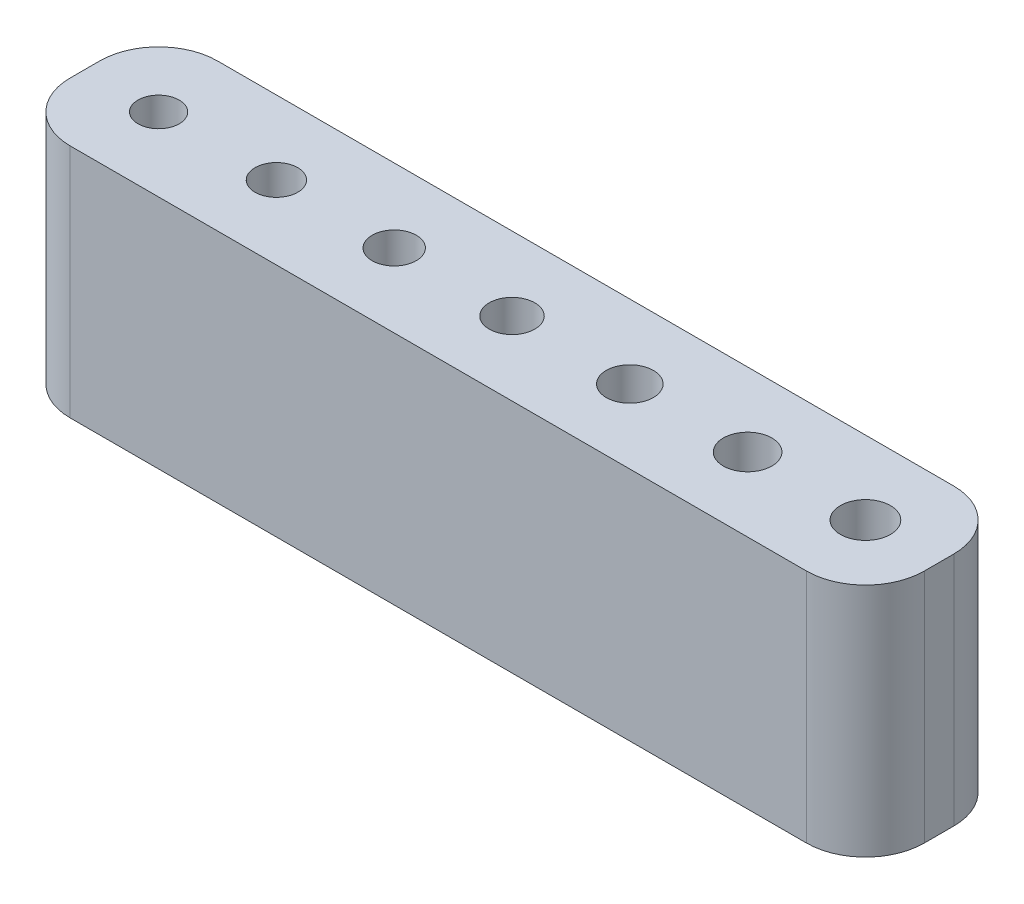
ISO-10303-21;
HEADER;
FILE_DESCRIPTION(('STEP AP214'),'2;1');
FILE_NAME('part.step','',(''),(''),'','','');
FILE_SCHEMA(('AUTOMOTIVE_DESIGN { 1 0 10303 214 1 1 1 1 }'));
ENDSEC;
DATA;
#1=APPLICATION_CONTEXT('core data for automotive mechanical design processes');
#2=APPLICATION_PROTOCOL_DEFINITION('international standard','automotive_design',2000,#1);
#3=PRODUCT_CONTEXT('',#1,'mechanical');
#4=PRODUCT('Part','Part','',(#3));
#5=PRODUCT_RELATED_PRODUCT_CATEGORY('part','',(#4));
#6=PRODUCT_DEFINITION_FORMATION('','',#4);
#7=PRODUCT_DEFINITION_CONTEXT('part definition',#1,'design');
#8=PRODUCT_DEFINITION('design','',#6,#7);
#9=PRODUCT_DEFINITION_SHAPE('','',#8);
#10=(LENGTH_UNIT() NAMED_UNIT(*) SI_UNIT(.MILLI.,.METRE.));
#11=(NAMED_UNIT(*) PLANE_ANGLE_UNIT() SI_UNIT($,.RADIAN.));
#12=(NAMED_UNIT(*) SI_UNIT($,.STERADIAN.) SOLID_ANGLE_UNIT());
#13=UNCERTAINTY_MEASURE_WITH_UNIT(LENGTH_MEASURE(1.E-05),#10,'distance_accuracy_value','');
#14=(GEOMETRIC_REPRESENTATION_CONTEXT(3) GLOBAL_UNCERTAINTY_ASSIGNED_CONTEXT((#13)) GLOBAL_UNIT_ASSIGNED_CONTEXT((#10,
#11,#12)) REPRESENTATION_CONTEXT('',''));
#15=CARTESIAN_POINT('',(0.,0.,0.));
#16=DIRECTION('',(0.,0.,1.));
#17=DIRECTION('',(1.,0.,0.));
#18=AXIS2_PLACEMENT_3D('',#15,#16,#17);
#19=CARTESIAN_POINT('',(0.,8.,0.));
#20=DIRECTION('',(0.,-1.,0.));
#21=DIRECTION('',(0.,0.,-1.));
#22=AXIS2_PLACEMENT_3D('',#19,#20,#21);
#23=PLANE('',#22);
#24=DIRECTION('',(1.,0.,0.));
#25=VECTOR('',#24,1.);
#26=CARTESIAN_POINT('',(0.,8.,0.));
#27=LINE('',#26,#25);
#28=CARTESIAN_POINT('',(2.,8.,0.));
#29=VERTEX_POINT('',#28);
#30=CARTESIAN_POINT('',(27.,8.,0.));
#31=VERTEX_POINT('',#30);
#32=EDGE_CURVE('E201',#29,#31,#27,.T.);
#33=ORIENTED_EDGE('',*,*,#32,.T.);
#34=CARTESIAN_POINT('',(27.,8.,-2.));
#35=DIRECTION('',(0.,-1.,0.));
#36=DIRECTION('',(0.,0.,-1.));
#37=AXIS2_PLACEMENT_3D('',#34,#35,#36);
#38=CIRCLE('',#37,2.);
#39=CARTESIAN_POINT('',(29.,8.,-2.));
#40=VERTEX_POINT('',#39);
#41=EDGE_CURVE('E174',#31,#40,#38,.F.);
#42=ORIENTED_EDGE('',*,*,#41,.T.);
#43=DIRECTION('',(0.,0.,-1.));
#44=VECTOR('',#43,1.);
#45=CARTESIAN_POINT('',(29.,8.,0.));
#46=LINE('',#45,#44);
#47=CARTESIAN_POINT('',(29.,8.,-3.));
#48=VERTEX_POINT('',#47);
#49=EDGE_CURVE('E131',#40,#48,#46,.T.);
#50=ORIENTED_EDGE('',*,*,#49,.T.);
#51=CARTESIAN_POINT('',(27.,8.,-3.));
#52=DIRECTION('',(0.,-1.,0.));
#53=DIRECTION('',(0.,0.,-1.));
#54=AXIS2_PLACEMENT_3D('',#51,#52,#53);
#55=CIRCLE('',#54,2.);
#56=CARTESIAN_POINT('',(27.,8.,-5.));
#57=VERTEX_POINT('',#56);
#58=EDGE_CURVE('E66',#48,#57,#55,.F.);
#59=ORIENTED_EDGE('',*,*,#58,.T.);
#60=DIRECTION('',(-1.,0.,0.));
#61=VECTOR('',#60,1.);
#62=CARTESIAN_POINT('',(0.,8.,-5.));
#63=LINE('',#62,#61);
#64=CARTESIAN_POINT('',(2.,8.,-5.));
#65=VERTEX_POINT('',#64);
#66=EDGE_CURVE('E153',#57,#65,#63,.T.);
#67=ORIENTED_EDGE('',*,*,#66,.T.);
#68=CARTESIAN_POINT('',(2.,8.,-3.));
#69=DIRECTION('',(0.,-1.,0.));
#70=DIRECTION('',(0.,0.,-1.));
#71=AXIS2_PLACEMENT_3D('',#68,#69,#70);
#72=CIRCLE('',#71,2.);
#73=CARTESIAN_POINT('',(0.,8.,-3.));
#74=VERTEX_POINT('',#73);
#75=EDGE_CURVE('E171',#65,#74,#72,.F.);
#76=ORIENTED_EDGE('',*,*,#75,.T.);
#77=DIRECTION('',(0.,0.,1.));
#78=VECTOR('',#77,1.);
#79=CARTESIAN_POINT('',(0.,8.,0.));
#80=LINE('',#79,#78);
#81=CARTESIAN_POINT('',(0.,8.,-2.));
#82=VERTEX_POINT('',#81);
#83=EDGE_CURVE('E146',#74,#82,#80,.T.);
#84=ORIENTED_EDGE('',*,*,#83,.T.);
#85=CARTESIAN_POINT('',(2.,8.,-2.));
#86=DIRECTION('',(0.,-1.,0.));
#87=DIRECTION('',(0.,0.,-1.));
#88=AXIS2_PLACEMENT_3D('',#85,#86,#87);
#89=CIRCLE('',#88,2.);
#90=EDGE_CURVE('E166',#82,#29,#89,.F.);
#91=ORIENTED_EDGE('',*,*,#90,.T.);
#92=EDGE_LOOP('',(#33,#42,#50,#59,#67,#76,#84,#91));
#93=FACE_BOUND('',#92,.T.);
#94=CARTESIAN_POINT('',(22.5,8.,-2.5));
#95=DIRECTION('',(0.,1.,0.));
#96=DIRECTION('',(0.,0.,1.));
#97=AXIS2_PLACEMENT_3D('',#94,#95,#96);
#98=CIRCLE('',#97,0.825000000000001);
#99=CARTESIAN_POINT('',(22.5,8.,-1.675));
#100=VERTEX_POINT('',#99);
#101=EDGE_CURVE('E214',#100,#100,#98,.T.);
#102=ORIENTED_EDGE('',*,*,#101,.F.);
#103=EDGE_LOOP('',(#102));
#104=FACE_BOUND('',#103,.T.);
#105=CARTESIAN_POINT('',(18.5,8.,-2.5));
#106=DIRECTION('',(0.,1.,0.));
#107=DIRECTION('',(0.,0.,1.));
#108=AXIS2_PLACEMENT_3D('',#105,#106,#107);
#109=CIRCLE('',#108,0.799999999999999);
#110=CARTESIAN_POINT('',(18.5,8.,-1.7));
#111=VERTEX_POINT('',#110);
#112=EDGE_CURVE('E221',#111,#111,#109,.T.);
#113=ORIENTED_EDGE('',*,*,#112,.F.);
#114=EDGE_LOOP('',(#113));
#115=FACE_BOUND('',#114,.T.);
#116=CARTESIAN_POINT('',(2.5,8.,-2.5));
#117=DIRECTION('',(0.,1.,0.));
#118=DIRECTION('',(0.,0.,1.));
#119=AXIS2_PLACEMENT_3D('',#116,#117,#118);
#120=CIRCLE('',#119,0.700000000000001);
#121=CARTESIAN_POINT('',(2.5,8.,-1.8));
#122=VERTEX_POINT('',#121);
#123=EDGE_CURVE('E227',#122,#122,#120,.T.);
#124=ORIENTED_EDGE('',*,*,#123,.F.);
#125=EDGE_LOOP('',(#124));
#126=FACE_BOUND('',#125,.T.);
#127=CARTESIAN_POINT('',(6.5,8.,-2.5));
#128=DIRECTION('',(0.,1.,0.));
#129=DIRECTION('',(0.,0.,1.));
#130=AXIS2_PLACEMENT_3D('',#127,#128,#129);
#131=CIRCLE('',#130,0.725);
#132=CARTESIAN_POINT('',(6.5,8.,-1.775));
#133=VERTEX_POINT('',#132);
#134=EDGE_CURVE('E235',#133,#133,#131,.T.);
#135=ORIENTED_EDGE('',*,*,#134,.F.);
#136=EDGE_LOOP('',(#135));
#137=FACE_BOUND('',#136,.T.);
#138=CARTESIAN_POINT('',(10.5,8.,-2.5));
#139=DIRECTION('',(0.,1.,0.));
#140=DIRECTION('',(0.,0.,1.));
#141=AXIS2_PLACEMENT_3D('',#138,#139,#140);
#142=CIRCLE('',#141,0.750000000000002);
#143=CARTESIAN_POINT('',(10.5,8.,-1.75));
#144=VERTEX_POINT('',#143);
#145=EDGE_CURVE('E243',#144,#144,#142,.T.);
#146=ORIENTED_EDGE('',*,*,#145,.F.);
#147=EDGE_LOOP('',(#146));
#148=FACE_BOUND('',#147,.T.);
#149=CARTESIAN_POINT('',(14.5,8.,-2.5));
#150=DIRECTION('',(0.,1.,0.));
#151=DIRECTION('',(0.,0.,1.));
#152=AXIS2_PLACEMENT_3D('',#149,#150,#151);
#153=CIRCLE('',#152,0.774999999999997);
#154=CARTESIAN_POINT('',(14.5,8.,-1.725));
#155=VERTEX_POINT('',#154);
#156=EDGE_CURVE('E251',#155,#155,#153,.T.);
#157=ORIENTED_EDGE('',*,*,#156,.F.);
#158=EDGE_LOOP('',(#157));
#159=FACE_BOUND('',#158,.T.);
#160=CARTESIAN_POINT('',(26.5,8.,-2.5));
#161=DIRECTION('',(0.,1.,0.));
#162=DIRECTION('',(0.,0.,1.));
#163=AXIS2_PLACEMENT_3D('',#160,#161,#162);
#164=CIRCLE('',#163,0.850000000000007);
#165=CARTESIAN_POINT('',(26.5,8.,-1.64999999999999));
#166=VERTEX_POINT('',#165);
#167=EDGE_CURVE('E259',#166,#166,#164,.T.);
#168=ORIENTED_EDGE('',*,*,#167,.F.);
#169=EDGE_LOOP('',(#168));
#170=FACE_BOUND('',#169,.T.);
#171=ADVANCED_FACE('F45',(#93,#104,#115,#126,#137,#148,#159,#170),#23,.F.);
#172=CARTESIAN_POINT('',(0.,0.,0.));
#173=DIRECTION('',(0.,-1.,0.));
#174=DIRECTION('',(0.,0.,-1.));
#175=AXIS2_PLACEMENT_3D('',#172,#173,#174);
#176=PLANE('',#175);
#177=CARTESIAN_POINT('',(14.5,0.,-2.5));
#178=DIRECTION('',(0.,1.,0.));
#179=DIRECTION('',(0.,0.,1.));
#180=AXIS2_PLACEMENT_3D('',#177,#178,#179);
#181=CIRCLE('',#180,0.774999999999997);
#182=CARTESIAN_POINT('',(14.5,0.,-1.725));
#183=VERTEX_POINT('',#182);
#184=EDGE_CURVE('E255',#183,#183,#181,.T.);
#185=ORIENTED_EDGE('',*,*,#184,.T.);
#186=EDGE_LOOP('',(#185));
#187=FACE_BOUND('',#186,.T.);
#188=CARTESIAN_POINT('',(6.5,0.,-2.5));
#189=DIRECTION('',(0.,1.,0.));
#190=DIRECTION('',(0.,0.,1.));
#191=AXIS2_PLACEMENT_3D('',#188,#189,#190);
#192=CIRCLE('',#191,0.725);
#193=CARTESIAN_POINT('',(6.5,0.,-1.775));
#194=VERTEX_POINT('',#193);
#195=EDGE_CURVE('E239',#194,#194,#192,.T.);
#196=ORIENTED_EDGE('',*,*,#195,.T.);
#197=EDGE_LOOP('',(#196));
#198=FACE_BOUND('',#197,.T.);
#199=CARTESIAN_POINT('',(18.5,0.,-2.5));
#200=DIRECTION('',(0.,1.,0.));
#201=DIRECTION('',(0.,0.,1.));
#202=AXIS2_PLACEMENT_3D('',#199,#200,#201);
#203=CIRCLE('',#202,0.799999999999999);
#204=CARTESIAN_POINT('',(18.5,0.,-1.7));
#205=VERTEX_POINT('',#204);
#206=EDGE_CURVE('E223',#205,#205,#203,.T.);
#207=ORIENTED_EDGE('',*,*,#206,.T.);
#208=EDGE_LOOP('',(#207));
#209=FACE_BOUND('',#208,.T.);
#210=DIRECTION('',(0.,0.,-1.));
#211=VECTOR('',#210,1.);
#212=CARTESIAN_POINT('',(29.,0.,0.));
#213=LINE('',#212,#211);
#214=CARTESIAN_POINT('',(29.,0.,-2.));
#215=VERTEX_POINT('',#214);
#216=CARTESIAN_POINT('',(29.,0.,-3.));
#217=VERTEX_POINT('',#216);
#218=EDGE_CURVE('E129',#215,#217,#213,.T.);
#219=ORIENTED_EDGE('',*,*,#218,.F.);
#220=CARTESIAN_POINT('',(27.,0.,-2.));
#221=DIRECTION('',(0.,-1.,0.));
#222=DIRECTION('',(0.,0.,-1.));
#223=AXIS2_PLACEMENT_3D('',#220,#221,#222);
#224=CIRCLE('',#223,2.);
#225=CARTESIAN_POINT('',(27.,0.,0.));
#226=VERTEX_POINT('',#225);
#227=EDGE_CURVE('E111',#215,#226,#224,.T.);
#228=ORIENTED_EDGE('',*,*,#227,.T.);
#229=DIRECTION('',(1.,0.,0.));
#230=VECTOR('',#229,1.);
#231=CARTESIAN_POINT('',(0.,0.,0.));
#232=LINE('',#231,#230);
#233=CARTESIAN_POINT('',(2.,0.,0.));
#234=VERTEX_POINT('',#233);
#235=EDGE_CURVE('E142',#234,#226,#232,.T.);
#236=ORIENTED_EDGE('',*,*,#235,.F.);
#237=CARTESIAN_POINT('',(2.,0.,-2.));
#238=DIRECTION('',(0.,-1.,0.));
#239=DIRECTION('',(0.,0.,-1.));
#240=AXIS2_PLACEMENT_3D('',#237,#238,#239);
#241=CIRCLE('',#240,2.);
#242=CARTESIAN_POINT('',(0.,0.,-2.));
#243=VERTEX_POINT('',#242);
#244=EDGE_CURVE('E133',#234,#243,#241,.T.);
#245=ORIENTED_EDGE('',*,*,#244,.T.);
#246=DIRECTION('',(0.,0.,1.));
#247=VECTOR('',#246,1.);
#248=CARTESIAN_POINT('',(0.,0.,0.));
#249=LINE('',#248,#247);
#250=CARTESIAN_POINT('',(0.,0.,-3.));
#251=VERTEX_POINT('',#250);
#252=EDGE_CURVE('E148',#251,#243,#249,.T.);
#253=ORIENTED_EDGE('',*,*,#252,.F.);
#254=CARTESIAN_POINT('',(2.,0.,-3.));
#255=DIRECTION('',(0.,-1.,0.));
#256=DIRECTION('',(0.,0.,-1.));
#257=AXIS2_PLACEMENT_3D('',#254,#255,#256);
#258=CIRCLE('',#257,2.);
#259=CARTESIAN_POINT('',(2.,0.,-5.));
#260=VERTEX_POINT('',#259);
#261=EDGE_CURVE('E123',#251,#260,#258,.T.);
#262=ORIENTED_EDGE('',*,*,#261,.T.);
#263=DIRECTION('',(-1.,0.,0.));
#264=VECTOR('',#263,1.);
#265=CARTESIAN_POINT('',(0.,0.,-5.));
#266=LINE('',#265,#264);
#267=CARTESIAN_POINT('',(27.,0.,-5.));
#268=VERTEX_POINT('',#267);
#269=EDGE_CURVE('E141',#268,#260,#266,.T.);
#270=ORIENTED_EDGE('',*,*,#269,.F.);
#271=CARTESIAN_POINT('',(27.,0.,-3.));
#272=DIRECTION('',(0.,-1.,0.));
#273=DIRECTION('',(0.,0.,-1.));
#274=AXIS2_PLACEMENT_3D('',#271,#272,#273);
#275=CIRCLE('',#274,2.);
#276=EDGE_CURVE('E139',#268,#217,#275,.T.);
#277=ORIENTED_EDGE('',*,*,#276,.T.);
#278=EDGE_LOOP('',(#219,#228,#236,#245,#253,#262,#270,#277));
#279=FACE_BOUND('',#278,.T.);
#280=CARTESIAN_POINT('',(22.5,0.,-2.5));
#281=DIRECTION('',(0.,1.,0.));
#282=DIRECTION('',(0.,0.,1.));
#283=AXIS2_PLACEMENT_3D('',#280,#281,#282);
#284=CIRCLE('',#283,0.825000000000001);
#285=CARTESIAN_POINT('',(22.5,0.,-1.675));
#286=VERTEX_POINT('',#285);
#287=EDGE_CURVE('E207',#286,#286,#284,.T.);
#288=ORIENTED_EDGE('',*,*,#287,.T.);
#289=EDGE_LOOP('',(#288));
#290=FACE_BOUND('',#289,.T.);
#291=CARTESIAN_POINT('',(2.5,0.,-2.5));
#292=DIRECTION('',(0.,1.,0.));
#293=DIRECTION('',(0.,0.,1.));
#294=AXIS2_PLACEMENT_3D('',#291,#292,#293);
#295=CIRCLE('',#294,0.700000000000001);
#296=CARTESIAN_POINT('',(2.5,0.,-1.8));
#297=VERTEX_POINT('',#296);
#298=EDGE_CURVE('E231',#297,#297,#295,.T.);
#299=ORIENTED_EDGE('',*,*,#298,.T.);
#300=EDGE_LOOP('',(#299));
#301=FACE_BOUND('',#300,.T.);
#302=CARTESIAN_POINT('',(10.5,0.,-2.5));
#303=DIRECTION('',(0.,1.,0.));
#304=DIRECTION('',(0.,0.,1.));
#305=AXIS2_PLACEMENT_3D('',#302,#303,#304);
#306=CIRCLE('',#305,0.750000000000002);
#307=CARTESIAN_POINT('',(10.5,0.,-1.75));
#308=VERTEX_POINT('',#307);
#309=EDGE_CURVE('E247',#308,#308,#306,.T.);
#310=ORIENTED_EDGE('',*,*,#309,.T.);
#311=EDGE_LOOP('',(#310));
#312=FACE_BOUND('',#311,.T.);
#313=CARTESIAN_POINT('',(26.5,0.,-2.5));
#314=DIRECTION('',(0.,1.,0.));
#315=DIRECTION('',(0.,0.,1.));
#316=AXIS2_PLACEMENT_3D('',#313,#314,#315);
#317=CIRCLE('',#316,0.850000000000007);
#318=CARTESIAN_POINT('',(26.5,0.,-1.64999999999999));
#319=VERTEX_POINT('',#318);
#320=EDGE_CURVE('E263',#319,#319,#317,.T.);
#321=ORIENTED_EDGE('',*,*,#320,.T.);
#322=EDGE_LOOP('',(#321));
#323=FACE_BOUND('',#322,.T.);
#324=ADVANCED_FACE('F136',(#187,#198,#209,#279,#290,#301,#312,#323),#176,.T.);
#325=CARTESIAN_POINT('',(0.,8.,0.));
#326=DIRECTION('',(1.,0.,0.));
#327=DIRECTION('',(0.,0.,-1.));
#328=AXIS2_PLACEMENT_3D('',#325,#326,#327);
#329=PLANE('',#328);
#330=ORIENTED_EDGE('',*,*,#83,.F.);
#331=DIRECTION('',(0.,-1.,0.));
#332=VECTOR('',#331,1.);
#333=CARTESIAN_POINT('',(0.,8.,-3.));
#334=LINE('',#333,#332);
#335=EDGE_CURVE('E180',#74,#251,#334,.T.);
#336=ORIENTED_EDGE('',*,*,#335,.T.);
#337=ORIENTED_EDGE('',*,*,#252,.T.);
#338=DIRECTION('',(0.,-1.,0.));
#339=VECTOR('',#338,1.);
#340=CARTESIAN_POINT('',(0.,8.,-2.));
#341=LINE('',#340,#339);
#342=EDGE_CURVE('E177',#243,#82,#341,.F.);
#343=ORIENTED_EDGE('',*,*,#342,.T.);
#344=EDGE_LOOP('',(#330,#336,#337,#343));
#345=FACE_BOUND('',#344,.T.);
#346=ADVANCED_FACE('F196',(#345),#329,.F.);
#347=CARTESIAN_POINT('',(0.,8.,0.));
#348=DIRECTION('',(0.,0.,-1.));
#349=DIRECTION('',(-1.,0.,0.));
#350=AXIS2_PLACEMENT_3D('',#347,#348,#349);
#351=PLANE('',#350);
#352=ORIENTED_EDGE('',*,*,#235,.T.);
#353=DIRECTION('',(0.,-1.,0.));
#354=VECTOR('',#353,1.);
#355=CARTESIAN_POINT('',(27.,8.,0.));
#356=LINE('',#355,#354);
#357=EDGE_CURVE('E116',#226,#31,#356,.F.);
#358=ORIENTED_EDGE('',*,*,#357,.T.);
#359=ORIENTED_EDGE('',*,*,#32,.F.);
#360=DIRECTION('',(0.,-1.,0.));
#361=VECTOR('',#360,1.);
#362=CARTESIAN_POINT('',(2.,8.,0.));
#363=LINE('',#362,#361);
#364=EDGE_CURVE('E122',#29,#234,#363,.T.);
#365=ORIENTED_EDGE('',*,*,#364,.T.);
#366=EDGE_LOOP('',(#352,#358,#359,#365));
#367=FACE_BOUND('',#366,.T.);
#368=ADVANCED_FACE('F291',(#367),#351,.F.);
#369=CARTESIAN_POINT('',(29.,8.,0.));
#370=DIRECTION('',(-1.,0.,0.));
#371=DIRECTION('',(0.,0.,1.));
#372=AXIS2_PLACEMENT_3D('',#369,#370,#371);
#373=PLANE('',#372);
#374=ORIENTED_EDGE('',*,*,#49,.F.);
#375=DIRECTION('',(0.,-1.,0.));
#376=VECTOR('',#375,1.);
#377=CARTESIAN_POINT('',(29.,8.,-2.));
#378=LINE('',#377,#376);
#379=EDGE_CURVE('E115',#40,#215,#378,.T.);
#380=ORIENTED_EDGE('',*,*,#379,.T.);
#381=ORIENTED_EDGE('',*,*,#218,.T.);
#382=DIRECTION('',(0.,-1.,0.));
#383=VECTOR('',#382,1.);
#384=CARTESIAN_POINT('',(29.,8.,-3.));
#385=LINE('',#384,#383);
#386=EDGE_CURVE('E134',#217,#48,#385,.F.);
#387=ORIENTED_EDGE('',*,*,#386,.T.);
#388=EDGE_LOOP('',(#374,#380,#381,#387));
#389=FACE_BOUND('',#388,.T.);
#390=ADVANCED_FACE('F128',(#389),#373,.F.);
#391=CARTESIAN_POINT('',(0.,8.,-5.));
#392=DIRECTION('',(0.,0.,1.));
#393=DIRECTION('',(1.,0.,0.));
#394=AXIS2_PLACEMENT_3D('',#391,#392,#393);
#395=PLANE('',#394);
#396=ORIENTED_EDGE('',*,*,#269,.T.);
#397=DIRECTION('',(0.,-1.,0.));
#398=VECTOR('',#397,1.);
#399=CARTESIAN_POINT('',(2.,8.,-5.));
#400=LINE('',#399,#398);
#401=EDGE_CURVE('E11',#260,#65,#400,.F.);
#402=ORIENTED_EDGE('',*,*,#401,.T.);
#403=ORIENTED_EDGE('',*,*,#66,.F.);
#404=DIRECTION('',(0.,-1.,0.));
#405=VECTOR('',#404,1.);
#406=CARTESIAN_POINT('',(27.,8.,-5.));
#407=LINE('',#406,#405);
#408=EDGE_CURVE('E54',#57,#268,#407,.T.);
#409=ORIENTED_EDGE('',*,*,#408,.T.);
#410=EDGE_LOOP('',(#396,#402,#403,#409));
#411=FACE_BOUND('',#410,.T.);
#412=ADVANCED_FACE('F186',(#411),#395,.F.);
#413=CARTESIAN_POINT('',(22.5,8.,-2.5));
#414=DIRECTION('',(0.,-1.,0.));
#415=DIRECTION('',(0.,0.,-1.));
#416=AXIS2_PLACEMENT_3D('',#413,#414,#415);
#417=CYLINDRICAL_SURFACE('',#416,0.825000000000001);
#418=ORIENTED_EDGE('',*,*,#101,.T.);
#419=EDGE_LOOP('',(#418));
#420=FACE_BOUND('',#419,.T.);
#421=ORIENTED_EDGE('',*,*,#287,.F.);
#422=EDGE_LOOP('',(#421));
#423=FACE_BOUND('',#422,.T.);
#424=ADVANCED_FACE('F284',(#420,#423),#417,.F.);
#425=CARTESIAN_POINT('',(18.5,8.,-2.5));
#426=DIRECTION('',(0.,-1.,0.));
#427=DIRECTION('',(0.,0.,-1.));
#428=AXIS2_PLACEMENT_3D('',#425,#426,#427);
#429=CYLINDRICAL_SURFACE('',#428,0.799999999999999);
#430=ORIENTED_EDGE('',*,*,#112,.T.);
#431=EDGE_LOOP('',(#430));
#432=FACE_BOUND('',#431,.T.);
#433=ORIENTED_EDGE('',*,*,#206,.F.);
#434=EDGE_LOOP('',(#433));
#435=FACE_BOUND('',#434,.T.);
#436=ADVANCED_FACE('F374',(#432,#435),#429,.F.);
#437=CARTESIAN_POINT('',(2.5,8.,-2.5));
#438=DIRECTION('',(0.,-1.,0.));
#439=DIRECTION('',(0.,0.,-1.));
#440=AXIS2_PLACEMENT_3D('',#437,#438,#439);
#441=CYLINDRICAL_SURFACE('',#440,0.700000000000001);
#442=ORIENTED_EDGE('',*,*,#123,.T.);
#443=EDGE_LOOP('',(#442));
#444=FACE_BOUND('',#443,.T.);
#445=ORIENTED_EDGE('',*,*,#298,.F.);
#446=EDGE_LOOP('',(#445));
#447=FACE_BOUND('',#446,.T.);
#448=ADVANCED_FACE('F364',(#444,#447),#441,.F.);
#449=CARTESIAN_POINT('',(6.5,8.,-2.5));
#450=DIRECTION('',(0.,-1.,0.));
#451=DIRECTION('',(0.,0.,-1.));
#452=AXIS2_PLACEMENT_3D('',#449,#450,#451);
#453=CYLINDRICAL_SURFACE('',#452,0.725);
#454=ORIENTED_EDGE('',*,*,#134,.T.);
#455=EDGE_LOOP('',(#454));
#456=FACE_BOUND('',#455,.T.);
#457=ORIENTED_EDGE('',*,*,#195,.F.);
#458=EDGE_LOOP('',(#457));
#459=FACE_BOUND('',#458,.T.);
#460=ADVANCED_FACE('F354',(#456,#459),#453,.F.);
#461=CARTESIAN_POINT('',(10.5,8.,-2.5));
#462=DIRECTION('',(0.,-1.,0.));
#463=DIRECTION('',(0.,0.,-1.));
#464=AXIS2_PLACEMENT_3D('',#461,#462,#463);
#465=CYLINDRICAL_SURFACE('',#464,0.750000000000002);
#466=ORIENTED_EDGE('',*,*,#145,.T.);
#467=EDGE_LOOP('',(#466));
#468=FACE_BOUND('',#467,.T.);
#469=ORIENTED_EDGE('',*,*,#309,.F.);
#470=EDGE_LOOP('',(#469));
#471=FACE_BOUND('',#470,.T.);
#472=ADVANCED_FACE('F344',(#468,#471),#465,.F.);
#473=CARTESIAN_POINT('',(14.5,8.,-2.5));
#474=DIRECTION('',(0.,-1.,0.));
#475=DIRECTION('',(0.,0.,-1.));
#476=AXIS2_PLACEMENT_3D('',#473,#474,#475);
#477=CYLINDRICAL_SURFACE('',#476,0.774999999999997);
#478=ORIENTED_EDGE('',*,*,#156,.T.);
#479=EDGE_LOOP('',(#478));
#480=FACE_BOUND('',#479,.T.);
#481=ORIENTED_EDGE('',*,*,#184,.F.);
#482=EDGE_LOOP('',(#481));
#483=FACE_BOUND('',#482,.T.);
#484=ADVANCED_FACE('F335',(#480,#483),#477,.F.);
#485=CARTESIAN_POINT('',(26.5,8.,-2.5));
#486=DIRECTION('',(0.,-1.,0.));
#487=DIRECTION('',(0.,0.,-1.));
#488=AXIS2_PLACEMENT_3D('',#485,#486,#487);
#489=CYLINDRICAL_SURFACE('',#488,0.850000000000007);
#490=ORIENTED_EDGE('',*,*,#167,.T.);
#491=EDGE_LOOP('',(#490));
#492=FACE_BOUND('',#491,.T.);
#493=ORIENTED_EDGE('',*,*,#320,.F.);
#494=EDGE_LOOP('',(#493));
#495=FACE_BOUND('',#494,.T.);
#496=ADVANCED_FACE('F271',(#492,#495),#489,.F.);
#497=CARTESIAN_POINT('',(27.,8.,-2.));
#498=DIRECTION('',(0.,-1.,0.));
#499=DIRECTION('',(0.,0.,-1.));
#500=AXIS2_PLACEMENT_3D('',#497,#498,#499);
#501=CYLINDRICAL_SURFACE('',#500,2.);
#502=ORIENTED_EDGE('',*,*,#41,.F.);
#503=ORIENTED_EDGE('',*,*,#357,.F.);
#504=ORIENTED_EDGE('',*,*,#227,.F.);
#505=ORIENTED_EDGE('',*,*,#379,.F.);
#506=EDGE_LOOP('',(#502,#503,#504,#505));
#507=FACE_BOUND('',#506,.T.);
#508=ADVANCED_FACE('F114',(#507),#501,.T.);
#509=CARTESIAN_POINT('',(2.,8.,-3.));
#510=DIRECTION('',(0.,-1.,0.));
#511=DIRECTION('',(0.,0.,-1.));
#512=AXIS2_PLACEMENT_3D('',#509,#510,#511);
#513=CYLINDRICAL_SURFACE('',#512,2.);
#514=ORIENTED_EDGE('',*,*,#75,.F.);
#515=ORIENTED_EDGE('',*,*,#401,.F.);
#516=ORIENTED_EDGE('',*,*,#261,.F.);
#517=ORIENTED_EDGE('',*,*,#335,.F.);
#518=EDGE_LOOP('',(#514,#515,#516,#517));
#519=FACE_BOUND('',#518,.T.);
#520=ADVANCED_FACE('F193',(#519),#513,.T.);
#521=CARTESIAN_POINT('',(27.,8.,-3.));
#522=DIRECTION('',(0.,-1.,0.));
#523=DIRECTION('',(0.,0.,-1.));
#524=AXIS2_PLACEMENT_3D('',#521,#522,#523);
#525=CYLINDRICAL_SURFACE('',#524,2.);
#526=ORIENTED_EDGE('',*,*,#58,.F.);
#527=ORIENTED_EDGE('',*,*,#386,.F.);
#528=ORIENTED_EDGE('',*,*,#276,.F.);
#529=ORIENTED_EDGE('',*,*,#408,.F.);
#530=EDGE_LOOP('',(#526,#527,#528,#529));
#531=FACE_BOUND('',#530,.T.);
#532=ADVANCED_FACE('F300',(#531),#525,.T.);
#533=CARTESIAN_POINT('',(2.,8.,-2.));
#534=DIRECTION('',(0.,-1.,0.));
#535=DIRECTION('',(0.,0.,-1.));
#536=AXIS2_PLACEMENT_3D('',#533,#534,#535);
#537=CYLINDRICAL_SURFACE('',#536,2.);
#538=ORIENTED_EDGE('',*,*,#90,.F.);
#539=ORIENTED_EDGE('',*,*,#342,.F.);
#540=ORIENTED_EDGE('',*,*,#244,.F.);
#541=ORIENTED_EDGE('',*,*,#364,.F.);
#542=EDGE_LOOP('',(#538,#539,#540,#541));
#543=FACE_BOUND('',#542,.T.);
#544=ADVANCED_FACE('F47',(#543),#537,.T.);
#545=CLOSED_SHELL('',(#171,#324,#346,#368,#390,#412,#424,#436,#448,#460,#472,#484,#496,#508,
#520,#532,#544));
#546=MANIFOLD_SOLID_BREP('B2',#545);
#547=ADVANCED_BREP_SHAPE_REPRESENTATION('',(#18,#546),#14);
#548=SHAPE_DEFINITION_REPRESENTATION(#9,#547);
ENDSEC;
END-ISO-10303-21;
